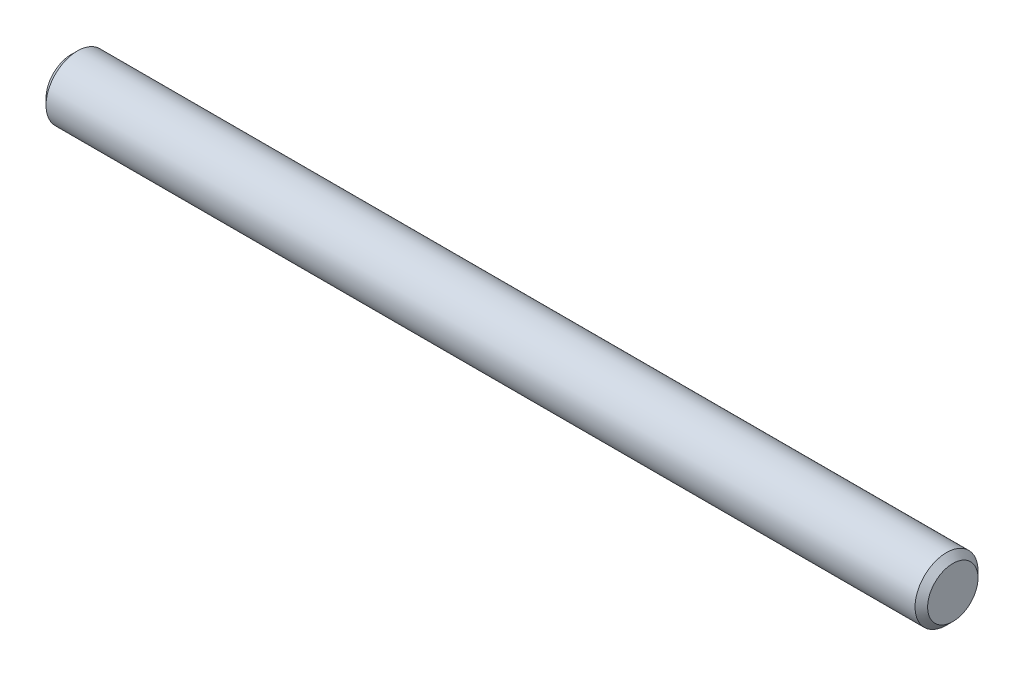
ISO-10303-21;
HEADER;
FILE_DESCRIPTION(('STEP AP214'),'2;1');
FILE_NAME('part.step','',(''),(''),'','','');
FILE_SCHEMA(('AUTOMOTIVE_DESIGN { 1 0 10303 214 1 1 1 1 }'));
ENDSEC;
DATA;
#1=APPLICATION_CONTEXT('core data for automotive mechanical design processes');
#2=APPLICATION_PROTOCOL_DEFINITION('international standard','automotive_design',2000,#1);
#3=PRODUCT_CONTEXT('',#1,'mechanical');
#4=PRODUCT('Part','Part','',(#3));
#5=PRODUCT_RELATED_PRODUCT_CATEGORY('part','',(#4));
#6=PRODUCT_DEFINITION_FORMATION('','',#4);
#7=PRODUCT_DEFINITION_CONTEXT('part definition',#1,'design');
#8=PRODUCT_DEFINITION('design','',#6,#7);
#9=PRODUCT_DEFINITION_SHAPE('','',#8);
#10=(LENGTH_UNIT() NAMED_UNIT(*) SI_UNIT(.MILLI.,.METRE.));
#11=(NAMED_UNIT(*) PLANE_ANGLE_UNIT() SI_UNIT($,.RADIAN.));
#12=(NAMED_UNIT(*) SI_UNIT($,.STERADIAN.) SOLID_ANGLE_UNIT());
#13=UNCERTAINTY_MEASURE_WITH_UNIT(LENGTH_MEASURE(1.E-05),#10,'distance_accuracy_value','');
#14=(GEOMETRIC_REPRESENTATION_CONTEXT(3) GLOBAL_UNCERTAINTY_ASSIGNED_CONTEXT((#13)) GLOBAL_UNIT_ASSIGNED_CONTEXT((#10,
#11,#12)) REPRESENTATION_CONTEXT('',''));
#15=CARTESIAN_POINT('',(0.,0.,0.));
#16=DIRECTION('',(0.,0.,1.));
#17=DIRECTION('',(1.,0.,0.));
#18=AXIS2_PLACEMENT_3D('',#15,#16,#17);
#19=CARTESIAN_POINT('',(-11.1125,0.,0.));
#20=DIRECTION('',(1.,0.,0.));
#21=DIRECTION('',(0.,0.,-1.));
#22=AXIS2_PLACEMENT_3D('',#19,#20,#21);
#23=CYLINDRICAL_SURFACE('',#22,0.79375);
#24=CARTESIAN_POINT('',(10.95375,0.,0.));
#25=DIRECTION('',(1.,0.,0.));
#26=DIRECTION('',(0.,0.,-1.));
#27=AXIS2_PLACEMENT_3D('',#24,#25,#26);
#28=CIRCLE('',#27,0.79375);
#29=CARTESIAN_POINT('',(10.95375,0.,-0.79375));
#30=VERTEX_POINT('',#29);
#31=EDGE_CURVE('E37',#30,#30,#28,.F.);
#32=ORIENTED_EDGE('',*,*,#31,.T.);
#33=EDGE_LOOP('',(#32));
#34=FACE_BOUND('',#33,.T.);
#35=CARTESIAN_POINT('',(-10.95375,0.,0.));
#36=DIRECTION('',(1.,0.,0.));
#37=DIRECTION('',(0.,0.,-1.));
#38=AXIS2_PLACEMENT_3D('',#35,#36,#37);
#39=CIRCLE('',#38,0.79375);
#40=CARTESIAN_POINT('',(-10.95375,0.,-0.79375));
#41=VERTEX_POINT('',#40);
#42=EDGE_CURVE('E41',#41,#41,#39,.T.);
#43=ORIENTED_EDGE('',*,*,#42,.T.);
#44=EDGE_LOOP('',(#43));
#45=FACE_BOUND('',#44,.T.);
#46=ADVANCED_FACE('F30',(#34,#45),#23,.T.);
#47=CARTESIAN_POINT('',(-11.1125,0.,0.));
#48=DIRECTION('',(1.,0.,0.));
#49=DIRECTION('',(0.,0.,-1.));
#50=AXIS2_PLACEMENT_3D('',#47,#48,#49);
#51=PLANE('',#50);
#52=CARTESIAN_POINT('',(-11.1125,0.,0.));
#53=DIRECTION('',(1.,0.,0.));
#54=DIRECTION('',(0.,0.,-1.));
#55=AXIS2_PLACEMENT_3D('',#52,#53,#54);
#56=CIRCLE('',#55,0.635000000000007);
#57=CARTESIAN_POINT('',(-11.1125,0.,-0.635000000000007));
#58=VERTEX_POINT('',#57);
#59=EDGE_CURVE('E10',#58,#58,#56,.F.);
#60=ORIENTED_EDGE('',*,*,#59,.T.);
#61=EDGE_LOOP('',(#60));
#62=FACE_BOUND('',#61,.T.);
#63=ADVANCED_FACE('F61',(#62),#51,.F.);
#64=CARTESIAN_POINT('',(11.1125,0.,0.));
#65=DIRECTION('',(1.,0.,0.));
#66=DIRECTION('',(0.,0.,-1.));
#67=AXIS2_PLACEMENT_3D('',#64,#65,#66);
#68=PLANE('',#67);
#69=CARTESIAN_POINT('',(11.1125,0.,0.));
#70=DIRECTION('',(1.,0.,0.));
#71=DIRECTION('',(0.,0.,-1.));
#72=AXIS2_PLACEMENT_3D('',#69,#70,#71);
#73=CIRCLE('',#72,0.634999999999998);
#74=CARTESIAN_POINT('',(11.1125,0.,-0.634999999999998));
#75=VERTEX_POINT('',#74);
#76=EDGE_CURVE('E45',#75,#75,#73,.T.);
#77=ORIENTED_EDGE('',*,*,#76,.T.);
#78=EDGE_LOOP('',(#77));
#79=FACE_BOUND('',#78,.T.);
#80=ADVANCED_FACE('F51',(#79),#68,.T.);
#81=CARTESIAN_POINT('',(11.1125,0.,0.));
#82=DIRECTION('',(-1.,0.,0.));
#83=DIRECTION('',(0.,0.,1.));
#84=AXIS2_PLACEMENT_3D('',#81,#82,#83);
#85=CONICAL_SURFACE('',#84,0.635,0.78539816339745);
#86=ORIENTED_EDGE('',*,*,#31,.F.);
#87=EDGE_LOOP('',(#86));
#88=FACE_BOUND('',#87,.T.);
#89=ORIENTED_EDGE('',*,*,#76,.F.);
#90=EDGE_LOOP('',(#89));
#91=FACE_BOUND('',#90,.T.);
#92=ADVANCED_FACE('F53',(#88,#91),#85,.T.);
#93=CARTESIAN_POINT('',(-10.95375,0.,0.));
#94=DIRECTION('',(1.,0.,0.));
#95=DIRECTION('',(0.,0.,-1.));
#96=AXIS2_PLACEMENT_3D('',#93,#94,#95);
#97=CONICAL_SURFACE('',#96,0.79375,0.785398163397439);
#98=ORIENTED_EDGE('',*,*,#59,.F.);
#99=EDGE_LOOP('',(#98));
#100=FACE_BOUND('',#99,.T.);
#101=ORIENTED_EDGE('',*,*,#42,.F.);
#102=EDGE_LOOP('',(#101));
#103=FACE_BOUND('',#102,.T.);
#104=ADVANCED_FACE('F32',(#100,#103),#97,.T.);
#105=CLOSED_SHELL('',(#46,#63,#80,#92,#104));
#106=MANIFOLD_SOLID_BREP('B2',#105);
#107=ADVANCED_BREP_SHAPE_REPRESENTATION('',(#18,#106),#14);
#108=SHAPE_DEFINITION_REPRESENTATION(#9,#107);
ENDSEC;
END-ISO-10303-21;
